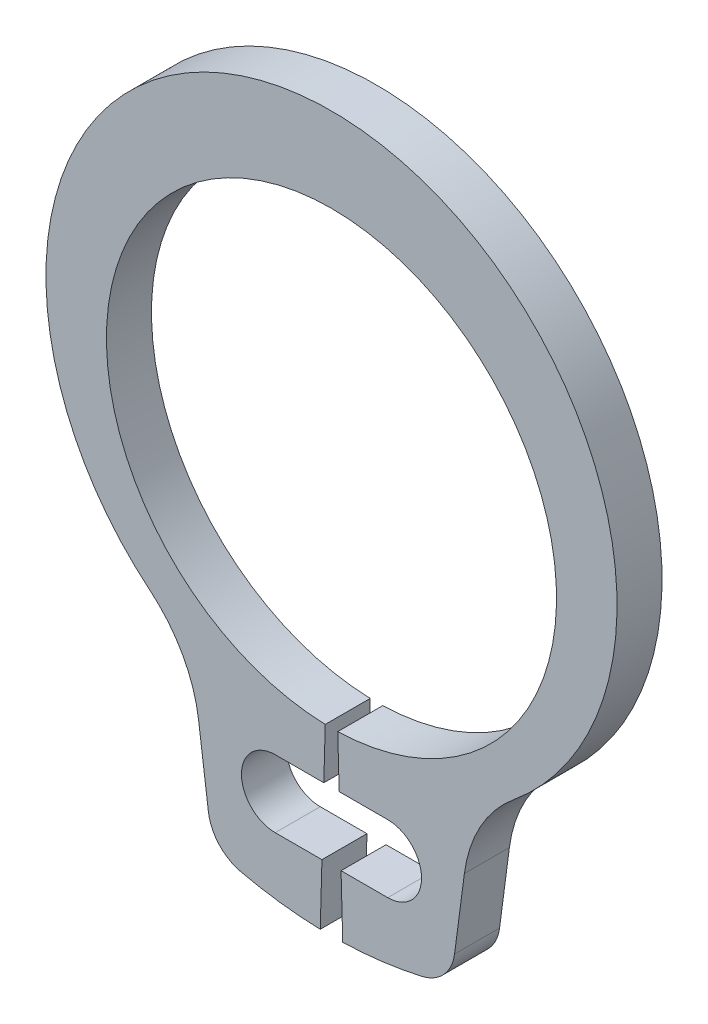
ISO-10303-21;
HEADER;
FILE_DESCRIPTION(('STEP AP214'),'2;1');
FILE_NAME('part.step','',(''),(''),'','','');
FILE_SCHEMA(('AUTOMOTIVE_DESIGN { 1 0 10303 214 1 1 1 1 }'));
ENDSEC;
DATA;
#1=APPLICATION_CONTEXT('core data for automotive mechanical design processes');
#2=APPLICATION_PROTOCOL_DEFINITION('international standard','automotive_design',2000,#1);
#3=PRODUCT_CONTEXT('',#1,'mechanical');
#4=PRODUCT('Part','Part','',(#3));
#5=PRODUCT_RELATED_PRODUCT_CATEGORY('part','',(#4));
#6=PRODUCT_DEFINITION_FORMATION('','',#4);
#7=PRODUCT_DEFINITION_CONTEXT('part definition',#1,'design');
#8=PRODUCT_DEFINITION('design','',#6,#7);
#9=PRODUCT_DEFINITION_SHAPE('','',#8);
#10=(LENGTH_UNIT() NAMED_UNIT(*) SI_UNIT(.MILLI.,.METRE.));
#11=(NAMED_UNIT(*) PLANE_ANGLE_UNIT() SI_UNIT($,.RADIAN.));
#12=(NAMED_UNIT(*) SI_UNIT($,.STERADIAN.) SOLID_ANGLE_UNIT());
#13=UNCERTAINTY_MEASURE_WITH_UNIT(LENGTH_MEASURE(1.E-05),#10,'distance_accuracy_value','');
#14=(GEOMETRIC_REPRESENTATION_CONTEXT(3) GLOBAL_UNCERTAINTY_ASSIGNED_CONTEXT((#13)) GLOBAL_UNIT_ASSIGNED_CONTEXT((#10,
#11,#12)) REPRESENTATION_CONTEXT('',''));
#15=CARTESIAN_POINT('',(0.,0.,0.));
#16=DIRECTION('',(0.,0.,1.));
#17=DIRECTION('',(1.,0.,0.));
#18=AXIS2_PLACEMENT_3D('',#15,#16,#17);
#19=CARTESIAN_POINT('',(-0.111111111111111,-3.99845649232146,-0.8));
#20=DIRECTION('',(0.999614123080366,-0.0277777777777778,0.));
#21=DIRECTION('',(0.0277777777777778,0.999614123080366,0.));
#22=AXIS2_PLACEMENT_3D('',#19,#20,#21);
#23=PLANE('',#22);
#24=DIRECTION('',(0.,0.,1.));
#25=VECTOR('',#24,1.);
#26=CARTESIAN_POINT('',(-0.136441286365026,-4.90999092558236,-0.8));
#27=LINE('',#26,#25);
#28=CARTESIAN_POINT('',(-0.136441286365026,-4.90999092558236,-0.8));
#29=VERTEX_POINT('',#28);
#30=CARTESIAN_POINT('',(-0.136441286365026,-4.90999092558236,0.));
#31=VERTEX_POINT('',#30);
#32=EDGE_CURVE('E204',#29,#31,#27,.T.);
#33=ORIENTED_EDGE('',*,*,#32,.F.);
#34=DIRECTION('',(0.0277777777777778,0.999614123080366,0.));
#35=VECTOR('',#34,1.);
#36=CARTESIAN_POINT('',(-0.111111111111111,-3.99845649232146,-0.8));
#37=LINE('',#36,#35);
#38=CARTESIAN_POINT('',(-0.111111111111111,-3.99845649232146,-0.8));
#39=VERTEX_POINT('',#38);
#40=EDGE_CURVE('E193',#29,#39,#37,.T.);
#41=ORIENTED_EDGE('',*,*,#40,.T.);
#42=DIRECTION('',(0.,0.,1.));
#43=VECTOR('',#42,1.);
#44=CARTESIAN_POINT('',(-0.111111111111111,-3.99845649232146,-0.8));
#45=LINE('',#44,#43);
#46=CARTESIAN_POINT('',(-0.111111111111111,-3.99845649232146,0.));
#47=VERTEX_POINT('',#46);
#48=EDGE_CURVE('E11',#39,#47,#45,.T.);
#49=ORIENTED_EDGE('',*,*,#48,.T.);
#50=DIRECTION('',(0.0277777777777778,0.999614123080366,0.));
#51=VECTOR('',#50,1.);
#52=CARTESIAN_POINT('',(-0.111111111111111,-3.99845649232146,0.));
#53=LINE('',#52,#51);
#54=EDGE_CURVE('E282',#31,#47,#53,.T.);
#55=ORIENTED_EDGE('',*,*,#54,.F.);
#56=EDGE_LOOP('',(#33,#41,#49,#55));
#57=FACE_BOUND('',#56,.T.);
#58=ADVANCED_FACE('F33',(#57),#23,.T.);
#59=CARTESIAN_POINT('',(0.111111111111111,-3.99845649232146,-0.8));
#60=DIRECTION('',(-0.999614123080366,-0.0277777777777778,0.));
#61=DIRECTION('',(0.0277777777777778,-0.999614123080366,0.));
#62=AXIS2_PLACEMENT_3D('',#59,#60,#61);
#63=PLANE('',#62);
#64=DIRECTION('',(0.,0.,-1.));
#65=VECTOR('',#64,1.);
#66=CARTESIAN_POINT('',(0.136441286365026,-4.90999092558236,-0.8));
#67=LINE('',#66,#65);
#68=CARTESIAN_POINT('',(0.136441286365026,-4.90999092558236,0.));
#69=VERTEX_POINT('',#68);
#70=CARTESIAN_POINT('',(0.136441286365026,-4.90999092558236,-0.8));
#71=VERTEX_POINT('',#70);
#72=EDGE_CURVE('E315',#69,#71,#67,.T.);
#73=ORIENTED_EDGE('',*,*,#72,.F.);
#74=DIRECTION('',(0.0277777777777778,-0.999614123080366,0.));
#75=VECTOR('',#74,1.);
#76=CARTESIAN_POINT('',(0.111111111111111,-3.99845649232146,0.));
#77=LINE('',#76,#75);
#78=CARTESIAN_POINT('',(0.111111111111111,-3.99845649232146,0.));
#79=VERTEX_POINT('',#78);
#80=EDGE_CURVE('E252',#79,#69,#77,.T.);
#81=ORIENTED_EDGE('',*,*,#80,.F.);
#82=DIRECTION('',(0.,0.,1.));
#83=VECTOR('',#82,1.);
#84=CARTESIAN_POINT('',(0.111111111111111,-3.99845649232146,-0.8));
#85=LINE('',#84,#83);
#86=CARTESIAN_POINT('',(0.111111111111111,-3.99845649232146,-0.8));
#87=VERTEX_POINT('',#86);
#88=EDGE_CURVE('E37',#87,#79,#85,.T.);
#89=ORIENTED_EDGE('',*,*,#88,.F.);
#90=DIRECTION('',(0.0277777777777778,-0.999614123080366,0.));
#91=VECTOR('',#90,1.);
#92=CARTESIAN_POINT('',(0.111111111111111,-3.99845649232146,-0.8));
#93=LINE('',#92,#91);
#94=EDGE_CURVE('E216',#87,#71,#93,.T.);
#95=ORIENTED_EDGE('',*,*,#94,.T.);
#96=EDGE_LOOP('',(#73,#81,#89,#95));
#97=FACE_BOUND('',#96,.T.);
#98=ADVANCED_FACE('F314',(#97),#63,.T.);
#99=CARTESIAN_POINT('',(0.,0.,-0.8));
#100=DIRECTION('',(0.,0.,1.));
#101=DIRECTION('',(1.,0.,0.));
#102=AXIS2_PLACEMENT_3D('',#99,#100,#101);
#103=CYLINDRICAL_SURFACE('',#102,4.);
#104=CARTESIAN_POINT('',(0.,0.,0.));
#105=DIRECTION('',(0.,0.,-1.));
#106=DIRECTION('',(1.,0.,0.));
#107=AXIS2_PLACEMENT_3D('',#104,#105,#106);
#108=CIRCLE('',#107,4.);
#109=EDGE_CURVE('E209',#47,#79,#108,.T.);
#110=ORIENTED_EDGE('',*,*,#109,.F.);
#111=ORIENTED_EDGE('',*,*,#48,.F.);
#112=CARTESIAN_POINT('',(0.,0.,-0.8));
#113=DIRECTION('',(0.,0.,-1.));
#114=DIRECTION('',(1.,0.,0.));
#115=AXIS2_PLACEMENT_3D('',#112,#113,#114);
#116=CIRCLE('',#115,4.);
#117=EDGE_CURVE('E211',#39,#87,#116,.T.);
#118=ORIENTED_EDGE('',*,*,#117,.T.);
#119=ORIENTED_EDGE('',*,*,#88,.T.);
#120=EDGE_LOOP('',(#110,#111,#118,#119));
#121=FACE_BOUND('',#120,.T.);
#122=ADVANCED_FACE('F35',(#121),#103,.F.);
#123=DIRECTION('',(0.,0.,-1.));
#124=VECTOR('',#123,1.);
#125=CARTESIAN_POINT('',(-0.16978748722763,-6.10999092558236,-0.8));
#126=LINE('',#125,#124);
#127=CARTESIAN_POINT('',(-0.16978748722763,-6.10999092558236,0.));
#128=VERTEX_POINT('',#127);
#129=CARTESIAN_POINT('',(-0.16978748722763,-6.10999092558236,-0.8));
#130=VERTEX_POINT('',#129);
#131=EDGE_CURVE('E336',#128,#130,#126,.T.);
#132=ORIENTED_EDGE('',*,*,#131,.F.);
#133=CARTESIAN_POINT('',(-0.2,-7.19722168617863,0.));
#134=VERTEX_POINT('',#133);
#135=EDGE_CURVE('E215',#134,#128,#53,.T.);
#136=ORIENTED_EDGE('',*,*,#135,.F.);
#137=DIRECTION('',(0.,0.,1.));
#138=VECTOR('',#137,1.);
#139=CARTESIAN_POINT('',(-0.2,-7.19722168617863,-0.8));
#140=LINE('',#139,#138);
#141=CARTESIAN_POINT('',(-0.2,-7.19722168617863,-0.8));
#142=VERTEX_POINT('',#141);
#143=EDGE_CURVE('E42',#142,#134,#140,.T.);
#144=ORIENTED_EDGE('',*,*,#143,.F.);
#145=EDGE_CURVE('E246',#142,#130,#37,.T.);
#146=ORIENTED_EDGE('',*,*,#145,.T.);
#147=EDGE_LOOP('',(#132,#136,#144,#146));
#148=FACE_BOUND('',#147,.T.);
#149=ADVANCED_FACE('F384',(#148),#23,.T.);
#150=CARTESIAN_POINT('',(0.,0.,-0.8));
#151=DIRECTION('',(0.,0.,1.));
#152=DIRECTION('',(1.,0.,0.));
#153=AXIS2_PLACEMENT_3D('',#150,#151,#152);
#154=CYLINDRICAL_SURFACE('',#153,7.2);
#155=CARTESIAN_POINT('',(0.,0.,0.));
#156=DIRECTION('',(0.,0.,1.));
#157=DIRECTION('',(1.,0.,0.));
#158=AXIS2_PLACEMENT_3D('',#155,#156,#157);
#159=CIRCLE('',#158,7.2);
#160=CARTESIAN_POINT('',(-1.61160656965067,-7.01731602998317,0.));
#161=VERTEX_POINT('',#160);
#162=EDGE_CURVE('E279',#161,#134,#159,.T.);
#163=ORIENTED_EDGE('',*,*,#162,.F.);
#164=DIRECTION('',(0.,0.,1.));
#165=VECTOR('',#164,1.);
#166=CARTESIAN_POINT('',(-1.61160656965067,-7.01731602998317,-0.8));
#167=LINE('',#166,#165);
#168=CARTESIAN_POINT('',(-1.61160656965067,-7.01731602998317,-0.8));
#169=VERTEX_POINT('',#168);
#170=EDGE_CURVE('E286',#169,#161,#167,.T.);
#171=ORIENTED_EDGE('',*,*,#170,.F.);
#172=CARTESIAN_POINT('',(0.,0.,-0.8));
#173=DIRECTION('',(0.,0.,1.));
#174=DIRECTION('',(1.,0.,0.));
#175=AXIS2_PLACEMENT_3D('',#172,#173,#174);
#176=CIRCLE('',#175,7.2);
#177=EDGE_CURVE('E243',#169,#142,#176,.T.);
#178=ORIENTED_EDGE('',*,*,#177,.T.);
#179=ORIENTED_EDGE('',*,*,#143,.T.);
#180=EDGE_LOOP('',(#163,#171,#178,#179));
#181=FACE_BOUND('',#180,.T.);
#182=ADVANCED_FACE('F380',(#181),#154,.T.);
#183=CARTESIAN_POINT('',(-1.44373088531206,-6.28634561019326,-0.8));
#184=DIRECTION('',(0.,0.,1.));
#185=DIRECTION('',(1.,0.,0.));
#186=AXIS2_PLACEMENT_3D('',#183,#184,#185);
#187=CYLINDRICAL_SURFACE('',#186,0.750000000000001);
#188=CARTESIAN_POINT('',(-1.44373088531206,-6.28634561019326,0.));
#189=DIRECTION('',(0.,0.,1.));
#190=DIRECTION('',(1.,0.,0.));
#191=AXIS2_PLACEMENT_3D('',#188,#189,#190);
#192=CIRCLE('',#191,0.750000000000001);
#193=CARTESIAN_POINT('',(-2.18731453134242,-6.3842402543583,0.));
#194=VERTEX_POINT('',#193);
#195=EDGE_CURVE('E276',#194,#161,#192,.T.);
#196=ORIENTED_EDGE('',*,*,#195,.F.);
#197=DIRECTION('',(0.,0.,1.));
#198=VECTOR('',#197,1.);
#199=CARTESIAN_POINT('',(-2.18731453134242,-6.3842402543583,-0.8));
#200=LINE('',#199,#198);
#201=CARTESIAN_POINT('',(-2.18731453134242,-6.3842402543583,-0.8));
#202=VERTEX_POINT('',#201);
#203=EDGE_CURVE('E288',#202,#194,#200,.T.);
#204=ORIENTED_EDGE('',*,*,#203,.F.);
#205=CARTESIAN_POINT('',(-1.44373088531206,-6.28634561019326,-0.8));
#206=DIRECTION('',(0.,0.,1.));
#207=DIRECTION('',(1.,0.,0.));
#208=AXIS2_PLACEMENT_3D('',#205,#206,#207);
#209=CIRCLE('',#208,0.750000000000001);
#210=EDGE_CURVE('E240',#202,#169,#209,.T.);
#211=ORIENTED_EDGE('',*,*,#210,.T.);
#212=ORIENTED_EDGE('',*,*,#170,.T.);
#213=EDGE_LOOP('',(#196,#204,#211,#212));
#214=FACE_BOUND('',#213,.T.);
#215=ADVANCED_FACE('F376',(#214),#187,.T.);
#216=CARTESIAN_POINT('',(-2.36199981611521,-5.05737378411277,-0.8));
#217=DIRECTION('',(-0.99144486137381,-0.130526192220053,0.));
#218=DIRECTION('',(0.130526192220053,-0.99144486137381,0.));
#219=AXIS2_PLACEMENT_3D('',#216,#217,#218);
#220=PLANE('',#219);
#221=DIRECTION('',(0.130526192220053,-0.99144486137381,0.));
#222=VECTOR('',#221,1.);
#223=CARTESIAN_POINT('',(-2.36199981611521,-5.05737378411277,0.));
#224=LINE('',#223,#222);
#225=CARTESIAN_POINT('',(-2.36199981611521,-5.05737378411277,0.));
#226=VERTEX_POINT('',#225);
#227=EDGE_CURVE('E273',#226,#194,#224,.T.);
#228=ORIENTED_EDGE('',*,*,#227,.F.);
#229=DIRECTION('',(0.,0.,1.));
#230=VECTOR('',#229,1.);
#231=CARTESIAN_POINT('',(-2.36199981611521,-5.05737378411277,-0.8));
#232=LINE('',#231,#230);
#233=CARTESIAN_POINT('',(-2.36199981611521,-5.05737378411277,-0.8));
#234=VERTEX_POINT('',#233);
#235=EDGE_CURVE('E290',#234,#226,#232,.T.);
#236=ORIENTED_EDGE('',*,*,#235,.F.);
#237=DIRECTION('',(0.130526192220053,-0.99144486137381,0.));
#238=VECTOR('',#237,1.);
#239=CARTESIAN_POINT('',(-2.36199981611521,-5.05737378411277,-0.8));
#240=LINE('',#239,#238);
#241=EDGE_CURVE('E237',#234,#202,#240,.T.);
#242=ORIENTED_EDGE('',*,*,#241,.T.);
#243=ORIENTED_EDGE('',*,*,#203,.T.);
#244=EDGE_LOOP('',(#228,#236,#242,#243));
#245=FACE_BOUND('',#244,.T.);
#246=ADVANCED_FACE('F371',(#245),#220,.T.);
#247=CARTESIAN_POINT('',(-4.78849836471971,-5.37682837842874,-0.8));
#248=DIRECTION('',(0.,0.,1.));
#249=DIRECTION('',(1.,0.,0.));
#250=AXIS2_PLACEMENT_3D('',#247,#248,#249);
#251=CYLINDRICAL_SURFACE('',#250,2.44743670892821);
#252=CARTESIAN_POINT('',(-4.78849836471971,-5.37682837842874,0.));
#253=DIRECTION('',(0.,0.,-1.));
#254=DIRECTION('',(1.,0.,0.));
#255=AXIS2_PLACEMENT_3D('',#252,#253,#254);
#256=CIRCLE('',#255,2.44743670892821);
#257=CARTESIAN_POINT('',(-3.2305829460221,-3.48927811621224,0.));
#258=VERTEX_POINT('',#257);
#259=EDGE_CURVE('E270',#258,#226,#256,.T.);
#260=ORIENTED_EDGE('',*,*,#259,.F.);
#261=DIRECTION('',(0.,0.,1.));
#262=VECTOR('',#261,1.);
#263=CARTESIAN_POINT('',(-3.2305829460221,-3.48927811621224,-0.8));
#264=LINE('',#263,#262);
#265=CARTESIAN_POINT('',(-3.2305829460221,-3.48927811621224,-0.8));
#266=VERTEX_POINT('',#265);
#267=EDGE_CURVE('E292',#266,#258,#264,.T.);
#268=ORIENTED_EDGE('',*,*,#267,.F.);
#269=CARTESIAN_POINT('',(-4.78849836471971,-5.37682837842874,-0.8));
#270=DIRECTION('',(0.,0.,-1.));
#271=DIRECTION('',(1.,0.,0.));
#272=AXIS2_PLACEMENT_3D('',#269,#270,#271);
#273=CIRCLE('',#272,2.44743670892821);
#274=EDGE_CURVE('E234',#266,#234,#273,.T.);
#275=ORIENTED_EDGE('',*,*,#274,.T.);
#276=ORIENTED_EDGE('',*,*,#235,.T.);
#277=EDGE_LOOP('',(#260,#268,#275,#276));
#278=FACE_BOUND('',#277,.T.);
#279=ADVANCED_FACE('F367',(#278),#251,.F.);
#280=CARTESIAN_POINT('',(0.,0.42485458553217,-0.8));
#281=DIRECTION('',(0.,0.,1.));
#282=DIRECTION('',(1.,0.,0.));
#283=AXIS2_PLACEMENT_3D('',#280,#281,#282);
#284=CYLINDRICAL_SURFACE('',#283,5.07514541446783);
#285=CARTESIAN_POINT('',(0.,0.42485458553217,0.));
#286=DIRECTION('',(0.,0.,1.));
#287=DIRECTION('',(1.,0.,0.));
#288=AXIS2_PLACEMENT_3D('',#285,#286,#287);
#289=CIRCLE('',#288,5.07514541446783);
#290=CARTESIAN_POINT('',(3.2305829460221,-3.48927811621224,0.));
#291=VERTEX_POINT('',#290);
#292=EDGE_CURVE('E267',#291,#258,#289,.T.);
#293=ORIENTED_EDGE('',*,*,#292,.F.);
#294=DIRECTION('',(0.,0.,1.));
#295=VECTOR('',#294,1.);
#296=CARTESIAN_POINT('',(3.2305829460221,-3.48927811621224,-0.8));
#297=LINE('',#296,#295);
#298=CARTESIAN_POINT('',(3.2305829460221,-3.48927811621224,-0.8));
#299=VERTEX_POINT('',#298);
#300=EDGE_CURVE('E294',#299,#291,#297,.T.);
#301=ORIENTED_EDGE('',*,*,#300,.F.);
#302=CARTESIAN_POINT('',(0.,0.42485458553217,-0.8));
#303=DIRECTION('',(0.,0.,1.));
#304=DIRECTION('',(1.,0.,0.));
#305=AXIS2_PLACEMENT_3D('',#302,#303,#304);
#306=CIRCLE('',#305,5.07514541446783);
#307=EDGE_CURVE('E231',#299,#266,#306,.T.);
#308=ORIENTED_EDGE('',*,*,#307,.T.);
#309=ORIENTED_EDGE('',*,*,#267,.T.);
#310=EDGE_LOOP('',(#293,#301,#308,#309));
#311=FACE_BOUND('',#310,.T.);
#312=ADVANCED_FACE('F363',(#311),#284,.T.);
#313=CARTESIAN_POINT('',(4.78849836471971,-5.37682837842874,-0.8));
#314=DIRECTION('',(0.,0.,1.));
#315=DIRECTION('',(1.,0.,0.));
#316=AXIS2_PLACEMENT_3D('',#313,#314,#315);
#317=CYLINDRICAL_SURFACE('',#316,2.44743670892821);
#318=CARTESIAN_POINT('',(4.78849836471971,-5.37682837842874,0.));
#319=DIRECTION('',(0.,0.,-1.));
#320=DIRECTION('',(1.,0.,0.));
#321=AXIS2_PLACEMENT_3D('',#318,#319,#320);
#322=CIRCLE('',#321,2.44743670892821);
#323=CARTESIAN_POINT('',(2.36199981611521,-5.05737378411276,0.));
#324=VERTEX_POINT('',#323);
#325=EDGE_CURVE('E264',#324,#291,#322,.T.);
#326=ORIENTED_EDGE('',*,*,#325,.F.);
#327=DIRECTION('',(0.,0.,1.));
#328=VECTOR('',#327,1.);
#329=CARTESIAN_POINT('',(2.36199981611521,-5.05737378411276,-0.8));
#330=LINE('',#329,#328);
#331=CARTESIAN_POINT('',(2.36199981611521,-5.05737378411276,-0.8));
#332=VERTEX_POINT('',#331);
#333=EDGE_CURVE('E296',#332,#324,#330,.T.);
#334=ORIENTED_EDGE('',*,*,#333,.F.);
#335=CARTESIAN_POINT('',(4.78849836471971,-5.37682837842874,-0.8));
#336=DIRECTION('',(0.,0.,-1.));
#337=DIRECTION('',(1.,0.,0.));
#338=AXIS2_PLACEMENT_3D('',#335,#336,#337);
#339=CIRCLE('',#338,2.44743670892821);
#340=EDGE_CURVE('E228',#332,#299,#339,.T.);
#341=ORIENTED_EDGE('',*,*,#340,.T.);
#342=ORIENTED_EDGE('',*,*,#300,.T.);
#343=EDGE_LOOP('',(#326,#334,#341,#342));
#344=FACE_BOUND('',#343,.T.);
#345=ADVANCED_FACE('F359',(#344),#317,.F.);
#346=CARTESIAN_POINT('',(2.36199981611521,-5.05737378411277,-0.8));
#347=DIRECTION('',(0.99144486137381,-0.130526192220053,0.));
#348=DIRECTION('',(0.130526192220053,0.99144486137381,0.));
#349=AXIS2_PLACEMENT_3D('',#346,#347,#348);
#350=PLANE('',#349);
#351=DIRECTION('',(0.130526192220053,0.99144486137381,0.));
#352=VECTOR('',#351,1.);
#353=CARTESIAN_POINT('',(2.36199981611521,-5.05737378411277,0.));
#354=LINE('',#353,#352);
#355=CARTESIAN_POINT('',(2.18731453134241,-6.3842402543583,0.));
#356=VERTEX_POINT('',#355);
#357=EDGE_CURVE('E261',#356,#324,#354,.T.);
#358=ORIENTED_EDGE('',*,*,#357,.F.);
#359=DIRECTION('',(0.,0.,1.));
#360=VECTOR('',#359,1.);
#361=CARTESIAN_POINT('',(2.18731453134241,-6.3842402543583,-0.8));
#362=LINE('',#361,#360);
#363=CARTESIAN_POINT('',(2.18731453134241,-6.3842402543583,-0.8));
#364=VERTEX_POINT('',#363);
#365=EDGE_CURVE('E298',#364,#356,#362,.T.);
#366=ORIENTED_EDGE('',*,*,#365,.F.);
#367=DIRECTION('',(0.130526192220053,0.99144486137381,0.));
#368=VECTOR('',#367,1.);
#369=CARTESIAN_POINT('',(2.36199981611521,-5.05737378411277,-0.8));
#370=LINE('',#369,#368);
#371=EDGE_CURVE('E225',#364,#332,#370,.T.);
#372=ORIENTED_EDGE('',*,*,#371,.T.);
#373=ORIENTED_EDGE('',*,*,#333,.T.);
#374=EDGE_LOOP('',(#358,#366,#372,#373));
#375=FACE_BOUND('',#374,.T.);
#376=ADVANCED_FACE('F355',(#375),#350,.T.);
#377=CARTESIAN_POINT('',(1.44373088531206,-6.28634561019326,-0.8));
#378=DIRECTION('',(0.,0.,1.));
#379=DIRECTION('',(1.,0.,0.));
#380=AXIS2_PLACEMENT_3D('',#377,#378,#379);
#381=CYLINDRICAL_SURFACE('',#380,0.750000000000001);
#382=CARTESIAN_POINT('',(1.44373088531206,-6.28634561019326,0.));
#383=DIRECTION('',(0.,0.,1.));
#384=DIRECTION('',(-1.,0.,0.));
#385=AXIS2_PLACEMENT_3D('',#382,#383,#384);
#386=CIRCLE('',#385,0.750000000000001);
#387=CARTESIAN_POINT('',(1.61160656965067,-7.01731602998317,0.));
#388=VERTEX_POINT('',#387);
#389=EDGE_CURVE('E258',#388,#356,#386,.T.);
#390=ORIENTED_EDGE('',*,*,#389,.F.);
#391=DIRECTION('',(0.,0.,1.));
#392=VECTOR('',#391,1.);
#393=CARTESIAN_POINT('',(1.61160656965067,-7.01731602998317,-0.8));
#394=LINE('',#393,#392);
#395=CARTESIAN_POINT('',(1.61160656965067,-7.01731602998317,-0.8));
#396=VERTEX_POINT('',#395);
#397=EDGE_CURVE('E300',#396,#388,#394,.T.);
#398=ORIENTED_EDGE('',*,*,#397,.F.);
#399=CARTESIAN_POINT('',(1.44373088531206,-6.28634561019326,-0.8));
#400=DIRECTION('',(0.,0.,1.));
#401=DIRECTION('',(-1.,0.,0.));
#402=AXIS2_PLACEMENT_3D('',#399,#400,#401);
#403=CIRCLE('',#402,0.750000000000001);
#404=EDGE_CURVE('E222',#396,#364,#403,.T.);
#405=ORIENTED_EDGE('',*,*,#404,.T.);
#406=ORIENTED_EDGE('',*,*,#365,.T.);
#407=EDGE_LOOP('',(#390,#398,#405,#406));
#408=FACE_BOUND('',#407,.T.);
#409=ADVANCED_FACE('F352',(#408),#381,.T.);
#410=CARTESIAN_POINT('',(0.,0.,-0.8));
#411=DIRECTION('',(0.,0.,1.));
#412=DIRECTION('',(1.,0.,0.));
#413=AXIS2_PLACEMENT_3D('',#410,#411,#412);
#414=CYLINDRICAL_SURFACE('',#413,7.2);
#415=CARTESIAN_POINT('',(0.,0.,0.));
#416=DIRECTION('',(0.,0.,1.));
#417=DIRECTION('',(1.,0.,0.));
#418=AXIS2_PLACEMENT_3D('',#415,#416,#417);
#419=CIRCLE('',#418,7.2);
#420=CARTESIAN_POINT('',(0.199999999999997,-7.19722168617863,0.));
#421=VERTEX_POINT('',#420);
#422=EDGE_CURVE('E255',#421,#388,#419,.T.);
#423=ORIENTED_EDGE('',*,*,#422,.F.);
#424=DIRECTION('',(0.,0.,1.));
#425=VECTOR('',#424,1.);
#426=CARTESIAN_POINT('',(0.199999999999997,-7.19722168617863,-0.8));
#427=LINE('',#426,#425);
#428=CARTESIAN_POINT('',(0.199999999999997,-7.19722168617863,-0.8));
#429=VERTEX_POINT('',#428);
#430=EDGE_CURVE('E301',#429,#421,#427,.T.);
#431=ORIENTED_EDGE('',*,*,#430,.F.);
#432=CARTESIAN_POINT('',(0.,0.,-0.8));
#433=DIRECTION('',(0.,0.,1.));
#434=DIRECTION('',(1.,0.,0.));
#435=AXIS2_PLACEMENT_3D('',#432,#433,#434);
#436=CIRCLE('',#435,7.2);
#437=EDGE_CURVE('E219',#429,#396,#436,.T.);
#438=ORIENTED_EDGE('',*,*,#437,.T.);
#439=ORIENTED_EDGE('',*,*,#397,.T.);
#440=EDGE_LOOP('',(#423,#431,#438,#439));
#441=FACE_BOUND('',#440,.T.);
#442=ADVANCED_FACE('F348',(#441),#414,.T.);
#443=DIRECTION('',(0.,0.,1.));
#444=VECTOR('',#443,1.);
#445=CARTESIAN_POINT('',(0.16978748722763,-6.10999092558236,-0.8));
#446=LINE('',#445,#444);
#447=CARTESIAN_POINT('',(0.16978748722763,-6.10999092558236,-0.8));
#448=VERTEX_POINT('',#447);
#449=CARTESIAN_POINT('',(0.16978748722763,-6.10999092558236,0.));
#450=VERTEX_POINT('',#449);
#451=EDGE_CURVE('E331',#448,#450,#446,.T.);
#452=ORIENTED_EDGE('',*,*,#451,.F.);
#453=EDGE_CURVE('E214',#448,#429,#93,.T.);
#454=ORIENTED_EDGE('',*,*,#453,.T.);
#455=ORIENTED_EDGE('',*,*,#430,.T.);
#456=EDGE_CURVE('E251',#450,#421,#77,.T.);
#457=ORIENTED_EDGE('',*,*,#456,.F.);
#458=EDGE_LOOP('',(#452,#454,#455,#457));
#459=FACE_BOUND('',#458,.T.);
#460=ADVANCED_FACE('F346',(#459),#63,.T.);
#461=CARTESIAN_POINT('',(0.,0.,-0.8));
#462=DIRECTION('',(0.,0.,1.));
#463=DIRECTION('',(1.,0.,0.));
#464=AXIS2_PLACEMENT_3D('',#461,#462,#463);
#465=PLANE('',#464);
#466=CARTESIAN_POINT('',(1.,-5.50999092558236,-0.8));
#467=DIRECTION('',(0.,0.,1.));
#468=DIRECTION('',(1.,0.,0.));
#469=AXIS2_PLACEMENT_3D('',#466,#467,#468);
#470=CIRCLE('',#469,0.6);
#471=CARTESIAN_POINT('',(1.,-6.10999092558236,-0.8));
#472=VERTEX_POINT('',#471);
#473=CARTESIAN_POINT('',(1.,-4.90999092558236,-0.8));
#474=VERTEX_POINT('',#473);
#475=EDGE_CURVE('E202',#472,#474,#470,.T.);
#476=ORIENTED_EDGE('',*,*,#475,.T.);
#477=DIRECTION('',(-1.,0.,0.));
#478=VECTOR('',#477,1.);
#479=CARTESIAN_POINT('',(-1.,-4.90999092558236,-0.8));
#480=LINE('',#479,#478);
#481=EDGE_CURVE('E58',#474,#71,#480,.T.);
#482=ORIENTED_EDGE('',*,*,#481,.T.);
#483=ORIENTED_EDGE('',*,*,#94,.F.);
#484=ORIENTED_EDGE('',*,*,#117,.F.);
#485=ORIENTED_EDGE('',*,*,#40,.F.);
#486=CARTESIAN_POINT('',(-1.,-4.90999092558236,-0.8));
#487=VERTEX_POINT('',#486);
#488=EDGE_CURVE('E174',#29,#487,#480,.T.);
#489=ORIENTED_EDGE('',*,*,#488,.T.);
#490=CARTESIAN_POINT('',(-1.,-5.50999092558236,-0.8));
#491=DIRECTION('',(0.,0.,1.));
#492=DIRECTION('',(1.,0.,0.));
#493=AXIS2_PLACEMENT_3D('',#490,#491,#492);
#494=CIRCLE('',#493,0.6);
#495=CARTESIAN_POINT('',(-1.,-6.10999092558236,-0.8));
#496=VERTEX_POINT('',#495);
#497=EDGE_CURVE('E191',#487,#496,#494,.T.);
#498=ORIENTED_EDGE('',*,*,#497,.T.);
#499=DIRECTION('',(1.,0.,0.));
#500=VECTOR('',#499,1.);
#501=CARTESIAN_POINT('',(1.,-6.10999092558236,-0.8));
#502=LINE('',#501,#500);
#503=EDGE_CURVE('E183',#496,#130,#502,.T.);
#504=ORIENTED_EDGE('',*,*,#503,.T.);
#505=ORIENTED_EDGE('',*,*,#145,.F.);
#506=ORIENTED_EDGE('',*,*,#177,.F.);
#507=ORIENTED_EDGE('',*,*,#210,.F.);
#508=ORIENTED_EDGE('',*,*,#241,.F.);
#509=ORIENTED_EDGE('',*,*,#274,.F.);
#510=ORIENTED_EDGE('',*,*,#307,.F.);
#511=ORIENTED_EDGE('',*,*,#340,.F.);
#512=ORIENTED_EDGE('',*,*,#371,.F.);
#513=ORIENTED_EDGE('',*,*,#404,.F.);
#514=ORIENTED_EDGE('',*,*,#437,.F.);
#515=ORIENTED_EDGE('',*,*,#453,.F.);
#516=EDGE_CURVE('E323',#448,#472,#502,.T.);
#517=ORIENTED_EDGE('',*,*,#516,.T.);
#518=EDGE_LOOP('',(#476,#482,#483,#484,#485,#489,#498,#504,#505,#506,#507,#508,#509,#510,#511,
#512,#513,#514,#515,#517));
#519=FACE_BOUND('',#518,.T.);
#520=ADVANCED_FACE('F189',(#519),#465,.F.);
#521=CARTESIAN_POINT('',(0.,0.,0.));
#522=DIRECTION('',(0.,0.,1.));
#523=DIRECTION('',(1.,0.,0.));
#524=AXIS2_PLACEMENT_3D('',#521,#522,#523);
#525=PLANE('',#524);
#526=DIRECTION('',(-1.,0.,0.));
#527=VECTOR('',#526,1.);
#528=CARTESIAN_POINT('',(-1.,-4.90999092558236,0.));
#529=LINE('',#528,#527);
#530=CARTESIAN_POINT('',(1.,-4.90999092558236,0.));
#531=VERTEX_POINT('',#530);
#532=EDGE_CURVE('E326',#531,#69,#529,.T.);
#533=ORIENTED_EDGE('',*,*,#532,.F.);
#534=CARTESIAN_POINT('',(1.,-5.50999092558236,0.));
#535=DIRECTION('',(0.,0.,1.));
#536=DIRECTION('',(1.,0.,0.));
#537=AXIS2_PLACEMENT_3D('',#534,#535,#536);
#538=CIRCLE('',#537,0.6);
#539=CARTESIAN_POINT('',(1.,-6.10999092558236,0.));
#540=VERTEX_POINT('',#539);
#541=EDGE_CURVE('E198',#540,#531,#538,.T.);
#542=ORIENTED_EDGE('',*,*,#541,.F.);
#543=DIRECTION('',(1.,0.,0.));
#544=VECTOR('',#543,1.);
#545=CARTESIAN_POINT('',(1.,-6.10999092558236,0.));
#546=LINE('',#545,#544);
#547=EDGE_CURVE('E50',#450,#540,#546,.T.);
#548=ORIENTED_EDGE('',*,*,#547,.F.);
#549=ORIENTED_EDGE('',*,*,#456,.T.);
#550=ORIENTED_EDGE('',*,*,#422,.T.);
#551=ORIENTED_EDGE('',*,*,#389,.T.);
#552=ORIENTED_EDGE('',*,*,#357,.T.);
#553=ORIENTED_EDGE('',*,*,#325,.T.);
#554=ORIENTED_EDGE('',*,*,#292,.T.);
#555=ORIENTED_EDGE('',*,*,#259,.T.);
#556=ORIENTED_EDGE('',*,*,#227,.T.);
#557=ORIENTED_EDGE('',*,*,#195,.T.);
#558=ORIENTED_EDGE('',*,*,#162,.T.);
#559=ORIENTED_EDGE('',*,*,#135,.T.);
#560=CARTESIAN_POINT('',(-1.,-6.10999092558236,0.));
#561=VERTEX_POINT('',#560);
#562=EDGE_CURVE('E194',#561,#128,#546,.T.);
#563=ORIENTED_EDGE('',*,*,#562,.F.);
#564=CARTESIAN_POINT('',(-1.,-5.50999092558236,0.));
#565=DIRECTION('',(0.,0.,1.));
#566=DIRECTION('',(1.,0.,0.));
#567=AXIS2_PLACEMENT_3D('',#564,#565,#566);
#568=CIRCLE('',#567,0.6);
#569=CARTESIAN_POINT('',(-1.,-4.90999092558236,0.));
#570=VERTEX_POINT('',#569);
#571=EDGE_CURVE('E199',#570,#561,#568,.T.);
#572=ORIENTED_EDGE('',*,*,#571,.F.);
#573=EDGE_CURVE('E177',#31,#570,#529,.T.);
#574=ORIENTED_EDGE('',*,*,#573,.F.);
#575=ORIENTED_EDGE('',*,*,#54,.T.);
#576=ORIENTED_EDGE('',*,*,#109,.T.);
#577=ORIENTED_EDGE('',*,*,#80,.T.);
#578=EDGE_LOOP('',(#533,#542,#548,#549,#550,#551,#552,#553,#554,#555,#556,#557,#558,#559,#563,
#572,#574,#575,#576,#577));
#579=FACE_BOUND('',#578,.T.);
#580=ADVANCED_FACE('F318',(#579),#525,.T.);
#581=CARTESIAN_POINT('',(1.,-5.50999092558236,-0.8));
#582=DIRECTION('',(0.,0.,1.));
#583=DIRECTION('',(1.,0.,0.));
#584=AXIS2_PLACEMENT_3D('',#581,#582,#583);
#585=CYLINDRICAL_SURFACE('',#584,0.6);
#586=ORIENTED_EDGE('',*,*,#541,.T.);
#587=DIRECTION('',(0.,0.,1.));
#588=VECTOR('',#587,1.);
#589=CARTESIAN_POINT('',(1.,-4.90999092558236,-0.8));
#590=LINE('',#589,#588);
#591=EDGE_CURVE('E329',#474,#531,#590,.T.);
#592=ORIENTED_EDGE('',*,*,#591,.F.);
#593=ORIENTED_EDGE('',*,*,#475,.F.);
#594=DIRECTION('',(0.,0.,1.));
#595=VECTOR('',#594,1.);
#596=CARTESIAN_POINT('',(1.,-6.10999092558236,-0.8));
#597=LINE('',#596,#595);
#598=EDGE_CURVE('E332',#472,#540,#597,.T.);
#599=ORIENTED_EDGE('',*,*,#598,.T.);
#600=EDGE_LOOP('',(#586,#592,#593,#599));
#601=FACE_BOUND('',#600,.T.);
#602=ADVANCED_FACE('F340',(#601),#585,.F.);
#603=CARTESIAN_POINT('',(-1.,-5.50999092558236,-0.8));
#604=DIRECTION('',(0.,0.,1.));
#605=DIRECTION('',(1.,0.,0.));
#606=AXIS2_PLACEMENT_3D('',#603,#604,#605);
#607=CYLINDRICAL_SURFACE('',#606,0.6);
#608=ORIENTED_EDGE('',*,*,#571,.T.);
#609=DIRECTION('',(0.,0.,1.));
#610=VECTOR('',#609,1.);
#611=CARTESIAN_POINT('',(-1.,-6.10999092558236,-0.8));
#612=LINE('',#611,#610);
#613=EDGE_CURVE('E182',#496,#561,#612,.T.);
#614=ORIENTED_EDGE('',*,*,#613,.F.);
#615=ORIENTED_EDGE('',*,*,#497,.F.);
#616=DIRECTION('',(0.,0.,1.));
#617=VECTOR('',#616,1.);
#618=CARTESIAN_POINT('',(-1.,-4.90999092558236,-0.8));
#619=LINE('',#618,#617);
#620=EDGE_CURVE('E171',#487,#570,#619,.T.);
#621=ORIENTED_EDGE('',*,*,#620,.T.);
#622=EDGE_LOOP('',(#608,#614,#615,#621));
#623=FACE_BOUND('',#622,.T.);
#624=ADVANCED_FACE('F197',(#623),#607,.F.);
#625=CARTESIAN_POINT('',(-1.,-4.90999092558236,-0.8));
#626=DIRECTION('',(0.,1.,0.));
#627=DIRECTION('',(0.,0.,1.));
#628=AXIS2_PLACEMENT_3D('',#625,#626,#627);
#629=PLANE('',#628);
#630=ORIENTED_EDGE('',*,*,#32,.T.);
#631=ORIENTED_EDGE('',*,*,#573,.T.);
#632=ORIENTED_EDGE('',*,*,#620,.F.);
#633=ORIENTED_EDGE('',*,*,#488,.F.);
#634=EDGE_LOOP('',(#630,#631,#632,#633));
#635=FACE_BOUND('',#634,.T.);
#636=ADVANCED_FACE('F173',(#635),#629,.F.);
#637=CARTESIAN_POINT('',(1.,-6.10999092558236,-0.8));
#638=DIRECTION('',(0.,-1.,0.));
#639=DIRECTION('',(0.,0.,-1.));
#640=AXIS2_PLACEMENT_3D('',#637,#638,#639);
#641=PLANE('',#640);
#642=ORIENTED_EDGE('',*,*,#131,.T.);
#643=ORIENTED_EDGE('',*,*,#503,.F.);
#644=ORIENTED_EDGE('',*,*,#613,.T.);
#645=ORIENTED_EDGE('',*,*,#562,.T.);
#646=EDGE_LOOP('',(#642,#643,#644,#645));
#647=FACE_BOUND('',#646,.T.);
#648=ADVANCED_FACE('F387',(#647),#641,.F.);
#649=ORIENTED_EDGE('',*,*,#451,.T.);
#650=ORIENTED_EDGE('',*,*,#547,.T.);
#651=ORIENTED_EDGE('',*,*,#598,.F.);
#652=ORIENTED_EDGE('',*,*,#516,.F.);
#653=EDGE_LOOP('',(#649,#650,#651,#652));
#654=FACE_BOUND('',#653,.T.);
#655=ADVANCED_FACE('F341',(#654),#641,.F.);
#656=ORIENTED_EDGE('',*,*,#72,.T.);
#657=ORIENTED_EDGE('',*,*,#481,.F.);
#658=ORIENTED_EDGE('',*,*,#591,.T.);
#659=ORIENTED_EDGE('',*,*,#532,.T.);
#660=EDGE_LOOP('',(#656,#657,#658,#659));
#661=FACE_BOUND('',#660,.T.);
#662=ADVANCED_FACE('F337',(#661),#629,.F.);
#663=CLOSED_SHELL('',(#58,#98,#122,#149,#182,#215,#246,#279,#312,#345,#376,#409,#442,#460,#520,
#580,#602,#624,#636,#648,#655,#662));
#664=MANIFOLD_SOLID_BREP('B2',#663);
#665=ADVANCED_BREP_SHAPE_REPRESENTATION('',(#18,#664),#14);
#666=SHAPE_DEFINITION_REPRESENTATION(#9,#665);
ENDSEC;
END-ISO-10303-21;
